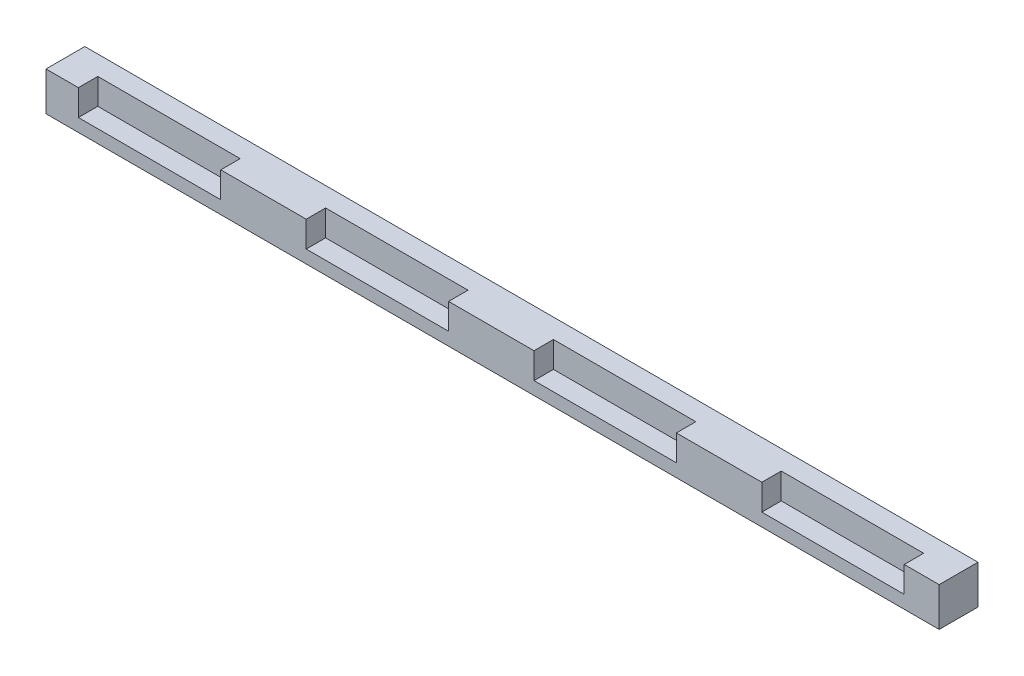
ISO-10303-21;
HEADER;
FILE_DESCRIPTION(('STEP AP214'),'2;1');
FILE_NAME('part.step','',(''),(''),'','','');
FILE_SCHEMA(('AUTOMOTIVE_DESIGN { 1 0 10303 214 1 1 1 1 }'));
ENDSEC;
DATA;
#1=APPLICATION_CONTEXT('core data for automotive mechanical design processes');
#2=APPLICATION_PROTOCOL_DEFINITION('international standard','automotive_design',2000,#1);
#3=PRODUCT_CONTEXT('',#1,'mechanical');
#4=PRODUCT('Part','Part','',(#3));
#5=PRODUCT_RELATED_PRODUCT_CATEGORY('part','',(#4));
#6=PRODUCT_DEFINITION_FORMATION('','',#4);
#7=PRODUCT_DEFINITION_CONTEXT('part definition',#1,'design');
#8=PRODUCT_DEFINITION('design','',#6,#7);
#9=PRODUCT_DEFINITION_SHAPE('','',#8);
#10=(LENGTH_UNIT() NAMED_UNIT(*) SI_UNIT(.MILLI.,.METRE.));
#11=(NAMED_UNIT(*) PLANE_ANGLE_UNIT() SI_UNIT($,.RADIAN.));
#12=(NAMED_UNIT(*) SI_UNIT($,.STERADIAN.) SOLID_ANGLE_UNIT());
#13=UNCERTAINTY_MEASURE_WITH_UNIT(LENGTH_MEASURE(1.E-05),#10,'distance_accuracy_value','');
#14=(GEOMETRIC_REPRESENTATION_CONTEXT(3) GLOBAL_UNCERTAINTY_ASSIGNED_CONTEXT((#13)) GLOBAL_UNIT_ASSIGNED_CONTEXT((#10,
#11,#12)) REPRESENTATION_CONTEXT('',''));
#15=CARTESIAN_POINT('',(0.,0.,0.));
#16=DIRECTION('',(0.,0.,1.));
#17=DIRECTION('',(1.,0.,0.));
#18=AXIS2_PLACEMENT_3D('',#15,#16,#17);
#19=CARTESIAN_POINT('',(44.0503208682354,37.6310916584124,30.));
#20=DIRECTION('',(1.,0.,0.));
#21=DIRECTION('',(0.,0.,-1.));
#22=AXIS2_PLACEMENT_3D('',#19,#20,#21);
#23=PLANE('',#22);
#24=DIRECTION('',(0.,-1.,0.));
#25=VECTOR('',#24,1.);
#26=CARTESIAN_POINT('',(44.0503208682354,37.6310916584124,0.));
#27=LINE('',#26,#25);
#28=CARTESIAN_POINT('',(44.0503208682354,37.6310916584124,0.));
#29=VERTEX_POINT('',#28);
#30=CARTESIAN_POINT('',(44.0503208682354,7.63109165841235,0.));
#31=VERTEX_POINT('',#30);
#32=EDGE_CURVE('E316',#29,#31,#27,.T.);
#33=ORIENTED_EDGE('',*,*,#32,.T.);
#34=DIRECTION('',(0.,0.,-1.));
#35=VECTOR('',#34,1.);
#36=CARTESIAN_POINT('',(44.0503208682354,7.63109165841235,30.));
#37=LINE('',#36,#35);
#38=CARTESIAN_POINT('',(44.0503208682354,7.63109165841235,30.));
#39=VERTEX_POINT('',#38);
#40=EDGE_CURVE('E11',#39,#31,#37,.T.);
#41=ORIENTED_EDGE('',*,*,#40,.F.);
#42=DIRECTION('',(0.,-1.,0.));
#43=VECTOR('',#42,1.);
#44=CARTESIAN_POINT('',(44.0503208682354,37.6310916584124,30.));
#45=LINE('',#44,#43);
#46=CARTESIAN_POINT('',(44.0503208682354,37.6310916584124,30.));
#47=VERTEX_POINT('',#46);
#48=EDGE_CURVE('E327',#47,#39,#45,.T.);
#49=ORIENTED_EDGE('',*,*,#48,.F.);
#50=DIRECTION('',(0.,0.,-1.));
#51=VECTOR('',#50,1.);
#52=CARTESIAN_POINT('',(44.0503208682354,37.6310916584124,30.));
#53=LINE('',#52,#51);
#54=EDGE_CURVE('E343',#47,#29,#53,.T.);
#55=ORIENTED_EDGE('',*,*,#54,.T.);
#56=EDGE_LOOP('',(#33,#41,#49,#55));
#57=FACE_BOUND('',#56,.T.);
#58=ADVANCED_FACE('F38',(#57),#23,.F.);
#59=CARTESIAN_POINT('',(44.0503208682354,7.63109165841235,30.));
#60=DIRECTION('',(0.,1.,0.));
#61=DIRECTION('',(0.,0.,1.));
#62=AXIS2_PLACEMENT_3D('',#59,#60,#61);
#63=PLANE('',#62);
#64=DIRECTION('',(1.,0.,0.));
#65=VECTOR('',#64,1.);
#66=CARTESIAN_POINT('',(44.0503208682354,7.63109165841235,0.));
#67=LINE('',#66,#65);
#68=CARTESIAN_POINT('',(734.050320868235,7.63109165841235,0.));
#69=VERTEX_POINT('',#68);
#70=EDGE_CURVE('E349',#31,#69,#67,.T.);
#71=ORIENTED_EDGE('',*,*,#70,.T.);
#72=DIRECTION('',(0.,0.,-1.));
#73=VECTOR('',#72,1.);
#74=CARTESIAN_POINT('',(734.050320868235,7.63109165841235,30.));
#75=LINE('',#74,#73);
#76=CARTESIAN_POINT('',(734.050320868235,7.63109165841235,30.));
#77=VERTEX_POINT('',#76);
#78=EDGE_CURVE('E46',#77,#69,#75,.T.);
#79=ORIENTED_EDGE('',*,*,#78,.F.);
#80=DIRECTION('',(1.,0.,0.));
#81=VECTOR('',#80,1.);
#82=CARTESIAN_POINT('',(44.0503208682354,7.63109165841235,30.));
#83=LINE('',#82,#81);
#84=EDGE_CURVE('E331',#39,#77,#83,.T.);
#85=ORIENTED_EDGE('',*,*,#84,.F.);
#86=ORIENTED_EDGE('',*,*,#40,.T.);
#87=EDGE_LOOP('',(#71,#79,#85,#86));
#88=FACE_BOUND('',#87,.T.);
#89=ADVANCED_FACE('F448',(#88),#63,.F.);
#90=CARTESIAN_POINT('',(734.050320868235,37.6310916584124,30.));
#91=DIRECTION('',(-1.,0.,0.));
#92=DIRECTION('',(0.,-1.,0.));
#93=AXIS2_PLACEMENT_3D('',#90,#91,#92);
#94=PLANE('',#93);
#95=DIRECTION('',(0.,1.,0.));
#96=VECTOR('',#95,1.);
#97=CARTESIAN_POINT('',(734.050320868235,37.6310916584124,0.));
#98=LINE('',#97,#96);
#99=CARTESIAN_POINT('',(734.050320868235,37.6310916584124,0.));
#100=VERTEX_POINT('',#99);
#101=EDGE_CURVE('E352',#69,#100,#98,.T.);
#102=ORIENTED_EDGE('',*,*,#101,.T.);
#103=DIRECTION('',(0.,0.,-1.));
#104=VECTOR('',#103,1.);
#105=CARTESIAN_POINT('',(734.050320868235,37.6310916584124,30.));
#106=LINE('',#105,#104);
#107=CARTESIAN_POINT('',(734.050320868235,37.6310916584124,30.));
#108=VERTEX_POINT('',#107);
#109=EDGE_CURVE('E360',#108,#100,#106,.T.);
#110=ORIENTED_EDGE('',*,*,#109,.F.);
#111=DIRECTION('',(0.,1.,0.));
#112=VECTOR('',#111,1.);
#113=CARTESIAN_POINT('',(734.050320868235,37.6310916584124,30.));
#114=LINE('',#113,#112);
#115=EDGE_CURVE('E335',#77,#108,#114,.T.);
#116=ORIENTED_EDGE('',*,*,#115,.F.);
#117=ORIENTED_EDGE('',*,*,#78,.T.);
#118=EDGE_LOOP('',(#102,#110,#116,#117));
#119=FACE_BOUND('',#118,.T.);
#120=ADVANCED_FACE('F369',(#119),#94,.F.);
#121=CARTESIAN_POINT('',(44.0503208682354,37.6310916584124,30.));
#122=DIRECTION('',(0.,-1.,0.));
#123=DIRECTION('',(0.,0.,-1.));
#124=AXIS2_PLACEMENT_3D('',#121,#122,#123);
#125=PLANE('',#124);
#126=DIRECTION('',(-1.,0.,0.));
#127=VECTOR('',#126,1.);
#128=CARTESIAN_POINT('',(44.0503208682354,37.6310916584124,30.));
#129=LINE('',#128,#127);
#130=CARTESIAN_POINT('',(245.050320868235,37.6310916584124,30.));
#131=VERTEX_POINT('',#130);
#132=CARTESIAN_POINT('',(179.050320868235,37.6310916584124,30.));
#133=VERTEX_POINT('',#132);
#134=EDGE_CURVE('E345',#131,#133,#129,.T.);
#135=ORIENTED_EDGE('',*,*,#134,.F.);
#136=DIRECTION('',(0.,0.,1.));
#137=VECTOR('',#136,1.);
#138=CARTESIAN_POINT('',(245.050320868235,37.6310916584124,30.));
#139=LINE('',#138,#137);
#140=CARTESIAN_POINT('',(245.050320868235,37.6310916584124,15.));
#141=VERTEX_POINT('',#140);
#142=EDGE_CURVE('E239',#141,#131,#139,.T.);
#143=ORIENTED_EDGE('',*,*,#142,.F.);
#144=DIRECTION('',(-1.,0.,0.));
#145=VECTOR('',#144,1.);
#146=CARTESIAN_POINT('',(245.050320868235,37.6310916584124,15.));
#147=LINE('',#146,#145);
#148=CARTESIAN_POINT('',(355.050320868235,37.6310916584124,15.));
#149=VERTEX_POINT('',#148);
#150=EDGE_CURVE('E412',#149,#141,#147,.T.);
#151=ORIENTED_EDGE('',*,*,#150,.F.);
#152=DIRECTION('',(0.,0.,-1.));
#153=VECTOR('',#152,1.);
#154=CARTESIAN_POINT('',(355.050320868235,37.6310916584124,30.));
#155=LINE('',#154,#153);
#156=CARTESIAN_POINT('',(355.050320868235,37.6310916584124,30.));
#157=VERTEX_POINT('',#156);
#158=EDGE_CURVE('E409',#157,#149,#155,.T.);
#159=ORIENTED_EDGE('',*,*,#158,.F.);
#160=CARTESIAN_POINT('',(421.050320868235,37.6310916584124,30.));
#161=VERTEX_POINT('',#160);
#162=EDGE_CURVE('E200',#161,#157,#129,.T.);
#163=ORIENTED_EDGE('',*,*,#162,.F.);
#164=DIRECTION('',(0.,0.,1.));
#165=VECTOR('',#164,1.);
#166=CARTESIAN_POINT('',(421.050320868235,37.6310916584124,30.));
#167=LINE('',#166,#165);
#168=CARTESIAN_POINT('',(421.050320868235,37.6310916584124,15.));
#169=VERTEX_POINT('',#168);
#170=EDGE_CURVE('E225',#169,#161,#167,.T.);
#171=ORIENTED_EDGE('',*,*,#170,.F.);
#172=DIRECTION('',(-1.,0.,0.));
#173=VECTOR('',#172,1.);
#174=CARTESIAN_POINT('',(421.050320868235,37.6310916584124,15.));
#175=LINE('',#174,#173);
#176=CARTESIAN_POINT('',(531.050320868235,37.6310916584124,15.));
#177=VERTEX_POINT('',#176);
#178=EDGE_CURVE('E214',#177,#169,#175,.T.);
#179=ORIENTED_EDGE('',*,*,#178,.F.);
#180=DIRECTION('',(0.,0.,-1.));
#181=VECTOR('',#180,1.);
#182=CARTESIAN_POINT('',(531.050320868235,37.6310916584124,30.));
#183=LINE('',#182,#181);
#184=CARTESIAN_POINT('',(531.050320868235,37.6310916584124,30.));
#185=VERTEX_POINT('',#184);
#186=EDGE_CURVE('E228',#185,#177,#183,.T.);
#187=ORIENTED_EDGE('',*,*,#186,.F.);
#188=CARTESIAN_POINT('',(597.050320868235,37.6310916584124,30.));
#189=VERTEX_POINT('',#188);
#190=EDGE_CURVE('E344',#189,#185,#129,.T.);
#191=ORIENTED_EDGE('',*,*,#190,.F.);
#192=DIRECTION('',(0.,0.,1.));
#193=VECTOR('',#192,1.);
#194=CARTESIAN_POINT('',(597.050320868235,37.6310916584124,30.));
#195=LINE('',#194,#193);
#196=CARTESIAN_POINT('',(597.050320868235,37.6310916584124,15.));
#197=VERTEX_POINT('',#196);
#198=EDGE_CURVE('E265',#197,#189,#195,.T.);
#199=ORIENTED_EDGE('',*,*,#198,.F.);
#200=DIRECTION('',(-1.,0.,0.));
#201=VECTOR('',#200,1.);
#202=CARTESIAN_POINT('',(597.050320868235,37.6310916584124,15.));
#203=LINE('',#202,#201);
#204=CARTESIAN_POINT('',(707.050320868235,37.6310916584124,15.));
#205=VERTEX_POINT('',#204);
#206=EDGE_CURVE('E252',#205,#197,#203,.T.);
#207=ORIENTED_EDGE('',*,*,#206,.F.);
#208=DIRECTION('',(0.,0.,-1.));
#209=VECTOR('',#208,1.);
#210=CARTESIAN_POINT('',(707.050320868235,37.6310916584124,30.));
#211=LINE('',#210,#209);
#212=CARTESIAN_POINT('',(707.050320868235,37.6310916584124,30.));
#213=VERTEX_POINT('',#212);
#214=EDGE_CURVE('E268',#213,#205,#211,.T.);
#215=ORIENTED_EDGE('',*,*,#214,.F.);
#216=EDGE_CURVE('E339',#108,#213,#129,.T.);
#217=ORIENTED_EDGE('',*,*,#216,.F.);
#218=ORIENTED_EDGE('',*,*,#109,.T.);
#219=DIRECTION('',(-1.,0.,0.));
#220=VECTOR('',#219,1.);
#221=CARTESIAN_POINT('',(44.0503208682354,37.6310916584124,0.));
#222=LINE('',#221,#220);
#223=EDGE_CURVE('E332',#100,#29,#222,.T.);
#224=ORIENTED_EDGE('',*,*,#223,.T.);
#225=ORIENTED_EDGE('',*,*,#54,.F.);
#226=CARTESIAN_POINT('',(69.0503208682354,37.6310916584124,30.));
#227=VERTEX_POINT('',#226);
#228=EDGE_CURVE('E338',#227,#47,#129,.T.);
#229=ORIENTED_EDGE('',*,*,#228,.F.);
#230=DIRECTION('',(0.,0.,1.));
#231=VECTOR('',#230,1.);
#232=CARTESIAN_POINT('',(69.0503208682354,37.6310916584124,30.));
#233=LINE('',#232,#231);
#234=CARTESIAN_POINT('',(69.0503208682354,37.6310916584124,15.));
#235=VERTEX_POINT('',#234);
#236=EDGE_CURVE('E303',#235,#227,#233,.T.);
#237=ORIENTED_EDGE('',*,*,#236,.F.);
#238=DIRECTION('',(-1.,0.,0.));
#239=VECTOR('',#238,1.);
#240=CARTESIAN_POINT('',(69.0503208682354,37.6310916584124,15.));
#241=LINE('',#240,#239);
#242=CARTESIAN_POINT('',(179.050320868235,37.6310916584124,15.));
#243=VERTEX_POINT('',#242);
#244=EDGE_CURVE('E290',#243,#235,#241,.T.);
#245=ORIENTED_EDGE('',*,*,#244,.F.);
#246=DIRECTION('',(0.,0.,-1.));
#247=VECTOR('',#246,1.);
#248=CARTESIAN_POINT('',(179.050320868235,37.6310916584124,30.));
#249=LINE('',#248,#247);
#250=EDGE_CURVE('E306',#133,#243,#249,.T.);
#251=ORIENTED_EDGE('',*,*,#250,.F.);
#252=EDGE_LOOP('',(#135,#143,#151,#159,#163,#171,#179,#187,#191,#199,#207,#215,#217,#218,#224,
#225,#229,#237,#245,#251));
#253=FACE_BOUND('',#252,.T.);
#254=ADVANCED_FACE('F379',(#253),#125,.F.);
#255=CARTESIAN_POINT('',(0.,0.,30.));
#256=DIRECTION('',(0.,0.,1.));
#257=DIRECTION('',(1.,0.,0.));
#258=AXIS2_PLACEMENT_3D('',#255,#256,#257);
#259=PLANE('',#258);
#260=DIRECTION('',(0.,1.,0.));
#261=VECTOR('',#260,1.);
#262=CARTESIAN_POINT('',(245.050320868235,17.6310916584124,30.));
#263=LINE('',#262,#261);
#264=CARTESIAN_POINT('',(245.050320868235,17.6310916584124,30.));
#265=VERTEX_POINT('',#264);
#266=EDGE_CURVE('E202',#265,#131,#263,.T.);
#267=ORIENTED_EDGE('',*,*,#266,.T.);
#268=ORIENTED_EDGE('',*,*,#134,.T.);
#269=DIRECTION('',(0.,1.,0.));
#270=VECTOR('',#269,1.);
#271=CARTESIAN_POINT('',(179.050320868235,17.6310916584124,30.));
#272=LINE('',#271,#270);
#273=CARTESIAN_POINT('',(179.050320868235,17.6310916584124,30.));
#274=VERTEX_POINT('',#273);
#275=EDGE_CURVE('E320',#274,#133,#272,.T.);
#276=ORIENTED_EDGE('',*,*,#275,.F.);
#277=DIRECTION('',(1.,0.,0.));
#278=VECTOR('',#277,1.);
#279=CARTESIAN_POINT('',(69.0503208682354,17.6310916584124,30.));
#280=LINE('',#279,#278);
#281=CARTESIAN_POINT('',(69.0503208682354,17.6310916584124,30.));
#282=VERTEX_POINT('',#281);
#283=EDGE_CURVE('E289',#282,#274,#280,.T.);
#284=ORIENTED_EDGE('',*,*,#283,.F.);
#285=DIRECTION('',(0.,1.,0.));
#286=VECTOR('',#285,1.);
#287=CARTESIAN_POINT('',(69.0503208682354,17.6310916584124,30.));
#288=LINE('',#287,#286);
#289=EDGE_CURVE('E302',#282,#227,#288,.T.);
#290=ORIENTED_EDGE('',*,*,#289,.T.);
#291=ORIENTED_EDGE('',*,*,#228,.T.);
#292=ORIENTED_EDGE('',*,*,#48,.T.);
#293=ORIENTED_EDGE('',*,*,#84,.T.);
#294=ORIENTED_EDGE('',*,*,#115,.T.);
#295=ORIENTED_EDGE('',*,*,#216,.T.);
#296=DIRECTION('',(0.,1.,0.));
#297=VECTOR('',#296,1.);
#298=CARTESIAN_POINT('',(707.050320868235,17.6310916584124,30.));
#299=LINE('',#298,#297);
#300=CARTESIAN_POINT('',(707.050320868235,17.6310916584124,30.));
#301=VERTEX_POINT('',#300);
#302=EDGE_CURVE('E280',#301,#213,#299,.T.);
#303=ORIENTED_EDGE('',*,*,#302,.F.);
#304=DIRECTION('',(1.,0.,0.));
#305=VECTOR('',#304,1.);
#306=CARTESIAN_POINT('',(597.050320868235,17.6310916584124,30.));
#307=LINE('',#306,#305);
#308=CARTESIAN_POINT('',(597.050320868235,17.6310916584124,30.));
#309=VERTEX_POINT('',#308);
#310=EDGE_CURVE('E251',#309,#301,#307,.T.);
#311=ORIENTED_EDGE('',*,*,#310,.F.);
#312=DIRECTION('',(0.,1.,0.));
#313=VECTOR('',#312,1.);
#314=CARTESIAN_POINT('',(597.050320868235,17.6310916584124,30.));
#315=LINE('',#314,#313);
#316=EDGE_CURVE('E264',#309,#189,#315,.T.);
#317=ORIENTED_EDGE('',*,*,#316,.T.);
#318=ORIENTED_EDGE('',*,*,#190,.T.);
#319=DIRECTION('',(0.,1.,0.));
#320=VECTOR('',#319,1.);
#321=CARTESIAN_POINT('',(531.050320868235,17.6310916584124,30.));
#322=LINE('',#321,#320);
#323=CARTESIAN_POINT('',(531.050320868235,17.6310916584124,30.));
#324=VERTEX_POINT('',#323);
#325=EDGE_CURVE('E243',#324,#185,#322,.T.);
#326=ORIENTED_EDGE('',*,*,#325,.F.);
#327=DIRECTION('',(1.,0.,0.));
#328=VECTOR('',#327,1.);
#329=CARTESIAN_POINT('',(421.050320868235,17.6310916584124,30.));
#330=LINE('',#329,#328);
#331=CARTESIAN_POINT('',(421.050320868235,17.6310916584124,30.));
#332=VERTEX_POINT('',#331);
#333=EDGE_CURVE('E213',#332,#324,#330,.T.);
#334=ORIENTED_EDGE('',*,*,#333,.F.);
#335=DIRECTION('',(0.,1.,0.));
#336=VECTOR('',#335,1.);
#337=CARTESIAN_POINT('',(421.050320868235,17.6310916584124,30.));
#338=LINE('',#337,#336);
#339=EDGE_CURVE('E224',#332,#161,#338,.T.);
#340=ORIENTED_EDGE('',*,*,#339,.T.);
#341=ORIENTED_EDGE('',*,*,#162,.T.);
#342=DIRECTION('',(0.,1.,0.));
#343=VECTOR('',#342,1.);
#344=CARTESIAN_POINT('',(355.050320868235,17.6310916584124,30.));
#345=LINE('',#344,#343);
#346=CARTESIAN_POINT('',(355.050320868235,17.6310916584124,30.));
#347=VERTEX_POINT('',#346);
#348=EDGE_CURVE('E182',#347,#157,#345,.T.);
#349=ORIENTED_EDGE('',*,*,#348,.F.);
#350=DIRECTION('',(1.,0.,0.));
#351=VECTOR('',#350,1.);
#352=CARTESIAN_POINT('',(245.050320868235,17.6310916584124,30.));
#353=LINE('',#352,#351);
#354=EDGE_CURVE('E188',#265,#347,#353,.T.);
#355=ORIENTED_EDGE('',*,*,#354,.F.);
#356=EDGE_LOOP('',(#267,#268,#276,#284,#290,#291,#292,#293,#294,#295,#303,#311,#317,#318,#326,
#334,#340,#341,#349,#355));
#357=FACE_BOUND('',#356,.T.);
#358=ADVANCED_FACE('F197',(#357),#259,.T.);
#359=CARTESIAN_POINT('',(0.,0.,0.));
#360=DIRECTION('',(0.,0.,1.));
#361=DIRECTION('',(1.,0.,0.));
#362=AXIS2_PLACEMENT_3D('',#359,#360,#361);
#363=PLANE('',#362);
#364=ORIENTED_EDGE('',*,*,#32,.F.);
#365=ORIENTED_EDGE('',*,*,#223,.F.);
#366=ORIENTED_EDGE('',*,*,#101,.F.);
#367=ORIENTED_EDGE('',*,*,#70,.F.);
#368=EDGE_LOOP('',(#364,#365,#366,#367));
#369=FACE_BOUND('',#368,.T.);
#370=ADVANCED_FACE('F375',(#369),#363,.F.);
#371=CARTESIAN_POINT('',(69.0503208682354,17.6310916584124,30.));
#372=DIRECTION('',(-1.,0.,0.));
#373=DIRECTION('',(0.,0.,1.));
#374=AXIS2_PLACEMENT_3D('',#371,#372,#373);
#375=PLANE('',#374);
#376=ORIENTED_EDGE('',*,*,#236,.T.);
#377=ORIENTED_EDGE('',*,*,#289,.F.);
#378=DIRECTION('',(0.,0.,1.));
#379=VECTOR('',#378,1.);
#380=CARTESIAN_POINT('',(69.0503208682354,17.6310916584124,30.));
#381=LINE('',#380,#379);
#382=CARTESIAN_POINT('',(69.0503208682354,17.6310916584124,15.));
#383=VERTEX_POINT('',#382);
#384=EDGE_CURVE('E286',#383,#282,#381,.T.);
#385=ORIENTED_EDGE('',*,*,#384,.F.);
#386=DIRECTION('',(0.,1.,0.));
#387=VECTOR('',#386,1.);
#388=CARTESIAN_POINT('',(69.0503208682354,17.6310916584124,15.));
#389=LINE('',#388,#387);
#390=EDGE_CURVE('E313',#383,#235,#389,.T.);
#391=ORIENTED_EDGE('',*,*,#390,.T.);
#392=EDGE_LOOP('',(#376,#377,#385,#391));
#393=FACE_BOUND('',#392,.T.);
#394=ADVANCED_FACE('F435',(#393),#375,.F.);
#395=CARTESIAN_POINT('',(69.0503208682354,17.6310916584124,15.));
#396=DIRECTION('',(0.,0.,-1.));
#397=DIRECTION('',(-1.,0.,0.));
#398=AXIS2_PLACEMENT_3D('',#395,#396,#397);
#399=PLANE('',#398);
#400=ORIENTED_EDGE('',*,*,#244,.T.);
#401=ORIENTED_EDGE('',*,*,#390,.F.);
#402=DIRECTION('',(-1.,0.,0.));
#403=VECTOR('',#402,1.);
#404=CARTESIAN_POINT('',(69.0503208682354,17.6310916584124,15.));
#405=LINE('',#404,#403);
#406=CARTESIAN_POINT('',(179.050320868235,17.6310916584124,15.));
#407=VERTEX_POINT('',#406);
#408=EDGE_CURVE('E298',#407,#383,#405,.T.);
#409=ORIENTED_EDGE('',*,*,#408,.F.);
#410=DIRECTION('',(0.,1.,0.));
#411=VECTOR('',#410,1.);
#412=CARTESIAN_POINT('',(179.050320868235,17.6310916584124,15.));
#413=LINE('',#412,#411);
#414=EDGE_CURVE('E317',#407,#243,#413,.T.);
#415=ORIENTED_EDGE('',*,*,#414,.T.);
#416=EDGE_LOOP('',(#400,#401,#409,#415));
#417=FACE_BOUND('',#416,.T.);
#418=ADVANCED_FACE('F437',(#417),#399,.F.);
#419=CARTESIAN_POINT('',(179.050320868235,17.6310916584124,30.));
#420=DIRECTION('',(1.,0.,0.));
#421=DIRECTION('',(0.,0.,-1.));
#422=AXIS2_PLACEMENT_3D('',#419,#420,#421);
#423=PLANE('',#422);
#424=ORIENTED_EDGE('',*,*,#250,.T.);
#425=ORIENTED_EDGE('',*,*,#414,.F.);
#426=DIRECTION('',(0.,0.,-1.));
#427=VECTOR('',#426,1.);
#428=CARTESIAN_POINT('',(179.050320868235,17.6310916584124,30.));
#429=LINE('',#428,#427);
#430=EDGE_CURVE('E294',#274,#407,#429,.T.);
#431=ORIENTED_EDGE('',*,*,#430,.F.);
#432=ORIENTED_EDGE('',*,*,#275,.T.);
#433=EDGE_LOOP('',(#424,#425,#431,#432));
#434=FACE_BOUND('',#433,.T.);
#435=ADVANCED_FACE('F429',(#434),#423,.F.);
#436=CARTESIAN_POINT('',(0.,17.6310916584124,0.));
#437=DIRECTION('',(0.,-1.,0.));
#438=DIRECTION('',(0.,0.,-1.));
#439=AXIS2_PLACEMENT_3D('',#436,#437,#438);
#440=PLANE('',#439);
#441=ORIENTED_EDGE('',*,*,#384,.T.);
#442=ORIENTED_EDGE('',*,*,#283,.T.);
#443=ORIENTED_EDGE('',*,*,#430,.T.);
#444=ORIENTED_EDGE('',*,*,#408,.T.);
#445=EDGE_LOOP('',(#441,#442,#443,#444));
#446=FACE_BOUND('',#445,.T.);
#447=ADVANCED_FACE('F432',(#446),#440,.F.);
#448=CARTESIAN_POINT('',(597.050320868235,17.6310916584124,30.));
#449=DIRECTION('',(-1.,0.,0.));
#450=DIRECTION('',(0.,0.,1.));
#451=AXIS2_PLACEMENT_3D('',#448,#449,#450);
#452=PLANE('',#451);
#453=ORIENTED_EDGE('',*,*,#198,.T.);
#454=ORIENTED_EDGE('',*,*,#316,.F.);
#455=DIRECTION('',(0.,0.,1.));
#456=VECTOR('',#455,1.);
#457=CARTESIAN_POINT('',(597.050320868235,17.6310916584124,30.));
#458=LINE('',#457,#456);
#459=CARTESIAN_POINT('',(597.050320868235,17.6310916584124,15.));
#460=VERTEX_POINT('',#459);
#461=EDGE_CURVE('E248',#460,#309,#458,.T.);
#462=ORIENTED_EDGE('',*,*,#461,.F.);
#463=DIRECTION('',(0.,1.,0.));
#464=VECTOR('',#463,1.);
#465=CARTESIAN_POINT('',(597.050320868235,17.6310916584124,15.));
#466=LINE('',#465,#464);
#467=EDGE_CURVE('E229',#460,#197,#466,.T.);
#468=ORIENTED_EDGE('',*,*,#467,.T.);
#469=EDGE_LOOP('',(#453,#454,#462,#468));
#470=FACE_BOUND('',#469,.T.);
#471=ADVANCED_FACE('F494',(#470),#452,.F.);
#472=CARTESIAN_POINT('',(597.050320868235,17.6310916584124,15.));
#473=DIRECTION('',(0.,0.,-1.));
#474=DIRECTION('',(-1.,0.,0.));
#475=AXIS2_PLACEMENT_3D('',#472,#473,#474);
#476=PLANE('',#475);
#477=ORIENTED_EDGE('',*,*,#206,.T.);
#478=ORIENTED_EDGE('',*,*,#467,.F.);
#479=DIRECTION('',(-1.,0.,0.));
#480=VECTOR('',#479,1.);
#481=CARTESIAN_POINT('',(597.050320868235,17.6310916584124,15.));
#482=LINE('',#481,#480);
#483=CARTESIAN_POINT('',(707.050320868235,17.6310916584124,15.));
#484=VERTEX_POINT('',#483);
#485=EDGE_CURVE('E260',#484,#460,#482,.T.);
#486=ORIENTED_EDGE('',*,*,#485,.F.);
#487=DIRECTION('',(0.,1.,0.));
#488=VECTOR('',#487,1.);
#489=CARTESIAN_POINT('',(707.050320868235,17.6310916584124,15.));
#490=LINE('',#489,#488);
#491=EDGE_CURVE('E277',#484,#205,#490,.T.);
#492=ORIENTED_EDGE('',*,*,#491,.T.);
#493=EDGE_LOOP('',(#477,#478,#486,#492));
#494=FACE_BOUND('',#493,.T.);
#495=ADVANCED_FACE('F523',(#494),#476,.F.);
#496=CARTESIAN_POINT('',(707.050320868235,17.6310916584124,30.));
#497=DIRECTION('',(1.,0.,0.));
#498=DIRECTION('',(0.,0.,-1.));
#499=AXIS2_PLACEMENT_3D('',#496,#497,#498);
#500=PLANE('',#499);
#501=ORIENTED_EDGE('',*,*,#214,.T.);
#502=ORIENTED_EDGE('',*,*,#491,.F.);
#503=DIRECTION('',(0.,0.,-1.));
#504=VECTOR('',#503,1.);
#505=CARTESIAN_POINT('',(707.050320868235,17.6310916584124,30.));
#506=LINE('',#505,#504);
#507=EDGE_CURVE('E256',#301,#484,#506,.T.);
#508=ORIENTED_EDGE('',*,*,#507,.F.);
#509=ORIENTED_EDGE('',*,*,#302,.T.);
#510=EDGE_LOOP('',(#501,#502,#508,#509));
#511=FACE_BOUND('',#510,.T.);
#512=ADVANCED_FACE('F530',(#511),#500,.F.);
#513=CARTESIAN_POINT('',(528.,17.6310916584124,0.));
#514=DIRECTION('',(0.,-1.,0.));
#515=DIRECTION('',(0.,0.,-1.));
#516=AXIS2_PLACEMENT_3D('',#513,#514,#515);
#517=PLANE('',#516);
#518=ORIENTED_EDGE('',*,*,#461,.T.);
#519=ORIENTED_EDGE('',*,*,#310,.T.);
#520=ORIENTED_EDGE('',*,*,#507,.T.);
#521=ORIENTED_EDGE('',*,*,#485,.T.);
#522=EDGE_LOOP('',(#518,#519,#520,#521));
#523=FACE_BOUND('',#522,.T.);
#524=ADVANCED_FACE('F538',(#523),#517,.F.);
#525=CARTESIAN_POINT('',(421.050320868235,17.6310916584124,30.));
#526=DIRECTION('',(-1.,0.,0.));
#527=DIRECTION('',(0.,0.,1.));
#528=AXIS2_PLACEMENT_3D('',#525,#526,#527);
#529=PLANE('',#528);
#530=ORIENTED_EDGE('',*,*,#170,.T.);
#531=ORIENTED_EDGE('',*,*,#339,.F.);
#532=DIRECTION('',(0.,0.,1.));
#533=VECTOR('',#532,1.);
#534=CARTESIAN_POINT('',(421.050320868235,17.6310916584124,30.));
#535=LINE('',#534,#533);
#536=CARTESIAN_POINT('',(421.050320868235,17.6310916584124,15.));
#537=VERTEX_POINT('',#536);
#538=EDGE_CURVE('E61',#537,#332,#535,.T.);
#539=ORIENTED_EDGE('',*,*,#538,.F.);
#540=DIRECTION('',(0.,1.,0.));
#541=VECTOR('',#540,1.);
#542=CARTESIAN_POINT('',(421.050320868235,17.6310916584124,15.));
#543=LINE('',#542,#541);
#544=EDGE_CURVE('E236',#537,#169,#543,.T.);
#545=ORIENTED_EDGE('',*,*,#544,.T.);
#546=EDGE_LOOP('',(#530,#531,#539,#545));
#547=FACE_BOUND('',#546,.T.);
#548=ADVANCED_FACE('F546',(#547),#529,.F.);
#549=CARTESIAN_POINT('',(421.050320868235,17.6310916584124,15.));
#550=DIRECTION('',(0.,0.,-1.));
#551=DIRECTION('',(-1.,0.,0.));
#552=AXIS2_PLACEMENT_3D('',#549,#550,#551);
#553=PLANE('',#552);
#554=ORIENTED_EDGE('',*,*,#178,.T.);
#555=ORIENTED_EDGE('',*,*,#544,.F.);
#556=DIRECTION('',(-1.,0.,0.));
#557=VECTOR('',#556,1.);
#558=CARTESIAN_POINT('',(421.050320868235,17.6310916584124,15.));
#559=LINE('',#558,#557);
#560=CARTESIAN_POINT('',(531.050320868235,17.6310916584124,15.));
#561=VERTEX_POINT('',#560);
#562=EDGE_CURVE('E221',#561,#537,#559,.T.);
#563=ORIENTED_EDGE('',*,*,#562,.F.);
#564=DIRECTION('',(0.,1.,0.));
#565=VECTOR('',#564,1.);
#566=CARTESIAN_POINT('',(531.050320868235,17.6310916584124,15.));
#567=LINE('',#566,#565);
#568=EDGE_CURVE('E240',#561,#177,#567,.T.);
#569=ORIENTED_EDGE('',*,*,#568,.T.);
#570=EDGE_LOOP('',(#554,#555,#563,#569));
#571=FACE_BOUND('',#570,.T.);
#572=ADVANCED_FACE('F554',(#571),#553,.F.);
#573=CARTESIAN_POINT('',(531.050320868235,17.6310916584124,30.));
#574=DIRECTION('',(1.,0.,0.));
#575=DIRECTION('',(0.,0.,-1.));
#576=AXIS2_PLACEMENT_3D('',#573,#574,#575);
#577=PLANE('',#576);
#578=ORIENTED_EDGE('',*,*,#186,.T.);
#579=ORIENTED_EDGE('',*,*,#568,.F.);
#580=DIRECTION('',(0.,0.,-1.));
#581=VECTOR('',#580,1.);
#582=CARTESIAN_POINT('',(531.050320868235,17.6310916584124,30.));
#583=LINE('',#582,#581);
#584=EDGE_CURVE('E217',#324,#561,#583,.T.);
#585=ORIENTED_EDGE('',*,*,#584,.F.);
#586=ORIENTED_EDGE('',*,*,#325,.T.);
#587=EDGE_LOOP('',(#578,#579,#585,#586));
#588=FACE_BOUND('',#587,.T.);
#589=ADVANCED_FACE('F404',(#588),#577,.F.);
#590=CARTESIAN_POINT('',(352.,17.6310916584124,0.));
#591=DIRECTION('',(0.,-1.,0.));
#592=DIRECTION('',(0.,0.,-1.));
#593=AXIS2_PLACEMENT_3D('',#590,#591,#592);
#594=PLANE('',#593);
#595=ORIENTED_EDGE('',*,*,#538,.T.);
#596=ORIENTED_EDGE('',*,*,#333,.T.);
#597=ORIENTED_EDGE('',*,*,#584,.T.);
#598=ORIENTED_EDGE('',*,*,#562,.T.);
#599=EDGE_LOOP('',(#595,#596,#597,#598));
#600=FACE_BOUND('',#599,.T.);
#601=ADVANCED_FACE('F406',(#600),#594,.F.);
#602=CARTESIAN_POINT('',(245.050320868235,17.6310916584124,30.));
#603=DIRECTION('',(-1.,0.,0.));
#604=DIRECTION('',(0.,0.,1.));
#605=AXIS2_PLACEMENT_3D('',#602,#603,#604);
#606=PLANE('',#605);
#607=ORIENTED_EDGE('',*,*,#142,.T.);
#608=ORIENTED_EDGE('',*,*,#266,.F.);
#609=DIRECTION('',(0.,0.,1.));
#610=VECTOR('',#609,1.);
#611=CARTESIAN_POINT('',(245.050320868235,17.6310916584124,30.));
#612=LINE('',#611,#610);
#613=CARTESIAN_POINT('',(245.050320868235,17.6310916584124,15.));
#614=VERTEX_POINT('',#613);
#615=EDGE_CURVE('E53',#614,#265,#612,.T.);
#616=ORIENTED_EDGE('',*,*,#615,.F.);
#617=DIRECTION('',(0.,1.,0.));
#618=VECTOR('',#617,1.);
#619=CARTESIAN_POINT('',(245.050320868235,17.6310916584124,15.));
#620=LINE('',#619,#618);
#621=EDGE_CURVE('E206',#614,#141,#620,.T.);
#622=ORIENTED_EDGE('',*,*,#621,.T.);
#623=EDGE_LOOP('',(#607,#608,#616,#622));
#624=FACE_BOUND('',#623,.T.);
#625=ADVANCED_FACE('F422',(#624),#606,.F.);
#626=CARTESIAN_POINT('',(245.050320868235,17.6310916584124,15.));
#627=DIRECTION('',(0.,0.,-1.));
#628=DIRECTION('',(-1.,0.,0.));
#629=AXIS2_PLACEMENT_3D('',#626,#627,#628);
#630=PLANE('',#629);
#631=ORIENTED_EDGE('',*,*,#150,.T.);
#632=ORIENTED_EDGE('',*,*,#621,.F.);
#633=DIRECTION('',(-1.,0.,0.));
#634=VECTOR('',#633,1.);
#635=CARTESIAN_POINT('',(245.050320868235,17.6310916584124,15.));
#636=LINE('',#635,#634);
#637=CARTESIAN_POINT('',(355.050320868235,17.6310916584124,15.));
#638=VERTEX_POINT('',#637);
#639=EDGE_CURVE('E187',#638,#614,#636,.T.);
#640=ORIENTED_EDGE('',*,*,#639,.F.);
#641=DIRECTION('',(0.,1.,0.));
#642=VECTOR('',#641,1.);
#643=CARTESIAN_POINT('',(355.050320868235,17.6310916584124,15.));
#644=LINE('',#643,#642);
#645=EDGE_CURVE('E184',#638,#149,#644,.T.);
#646=ORIENTED_EDGE('',*,*,#645,.T.);
#647=EDGE_LOOP('',(#631,#632,#640,#646));
#648=FACE_BOUND('',#647,.T.);
#649=ADVANCED_FACE('F424',(#648),#630,.F.);
#650=CARTESIAN_POINT('',(355.050320868235,17.6310916584124,30.));
#651=DIRECTION('',(1.,0.,0.));
#652=DIRECTION('',(0.,0.,-1.));
#653=AXIS2_PLACEMENT_3D('',#650,#651,#652);
#654=PLANE('',#653);
#655=ORIENTED_EDGE('',*,*,#158,.T.);
#656=ORIENTED_EDGE('',*,*,#645,.F.);
#657=DIRECTION('',(0.,0.,-1.));
#658=VECTOR('',#657,1.);
#659=CARTESIAN_POINT('',(355.050320868235,17.6310916584124,30.));
#660=LINE('',#659,#658);
#661=EDGE_CURVE('E178',#347,#638,#660,.T.);
#662=ORIENTED_EDGE('',*,*,#661,.F.);
#663=ORIENTED_EDGE('',*,*,#348,.T.);
#664=EDGE_LOOP('',(#655,#656,#662,#663));
#665=FACE_BOUND('',#664,.T.);
#666=ADVANCED_FACE('F180',(#665),#654,.F.);
#667=CARTESIAN_POINT('',(176.,17.6310916584124,0.));
#668=DIRECTION('',(0.,-1.,0.));
#669=DIRECTION('',(0.,0.,-1.));
#670=AXIS2_PLACEMENT_3D('',#667,#668,#669);
#671=PLANE('',#670);
#672=ORIENTED_EDGE('',*,*,#615,.T.);
#673=ORIENTED_EDGE('',*,*,#354,.T.);
#674=ORIENTED_EDGE('',*,*,#661,.T.);
#675=ORIENTED_EDGE('',*,*,#639,.T.);
#676=EDGE_LOOP('',(#672,#673,#674,#675));
#677=FACE_BOUND('',#676,.T.);
#678=ADVANCED_FACE('F191',(#677),#671,.F.);
#679=CLOSED_SHELL('',(#58,#89,#120,#254,#358,#370,#394,#418,#435,#447,#471,#495,#512,#524,#548,
#572,#589,#601,#625,#649,#666,#678));
#680=MANIFOLD_SOLID_BREP('B2',#679);
#681=ADVANCED_BREP_SHAPE_REPRESENTATION('',(#18,#680),#14);
#682=SHAPE_DEFINITION_REPRESENTATION(#9,#681);
ENDSEC;
END-ISO-10303-21;
